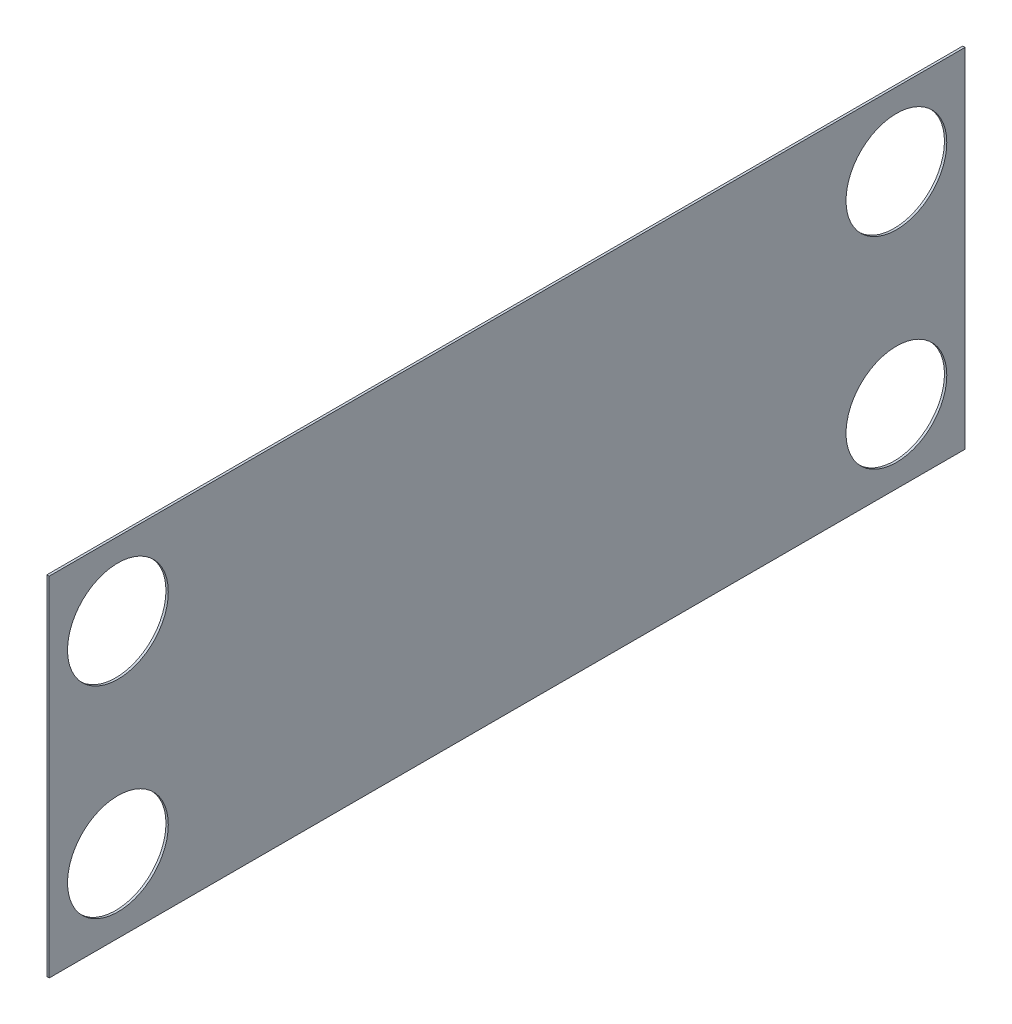
ISO-10303-21;
HEADER;
FILE_DESCRIPTION(('STEP AP214'),'2;1');
FILE_NAME('part.step','',(''),(''),'','','');
FILE_SCHEMA(('AUTOMOTIVE_DESIGN { 1 0 10303 214 1 1 1 1 }'));
ENDSEC;
DATA;
#1=APPLICATION_CONTEXT('core data for automotive mechanical design processes');
#2=APPLICATION_PROTOCOL_DEFINITION('international standard','automotive_design',2000,#1);
#3=PRODUCT_CONTEXT('',#1,'mechanical');
#4=PRODUCT('Part','Part','',(#3));
#5=PRODUCT_RELATED_PRODUCT_CATEGORY('part','',(#4));
#6=PRODUCT_DEFINITION_FORMATION('','',#4);
#7=PRODUCT_DEFINITION_CONTEXT('part definition',#1,'design');
#8=PRODUCT_DEFINITION('design','',#6,#7);
#9=PRODUCT_DEFINITION_SHAPE('','',#8);
#10=(LENGTH_UNIT() NAMED_UNIT(*) SI_UNIT(.MILLI.,.METRE.));
#11=(NAMED_UNIT(*) PLANE_ANGLE_UNIT() SI_UNIT($,.RADIAN.));
#12=(NAMED_UNIT(*) SI_UNIT($,.STERADIAN.) SOLID_ANGLE_UNIT());
#13=UNCERTAINTY_MEASURE_WITH_UNIT(LENGTH_MEASURE(1.E-05),#10,'distance_accuracy_value','');
#14=(GEOMETRIC_REPRESENTATION_CONTEXT(3) GLOBAL_UNCERTAINTY_ASSIGNED_CONTEXT((#13)) GLOBAL_UNIT_ASSIGNED_CONTEXT((#10,
#11,#12)) REPRESENTATION_CONTEXT('',''));
#15=CARTESIAN_POINT('',(0.,0.,0.));
#16=DIRECTION('',(0.,0.,1.));
#17=DIRECTION('',(1.,0.,0.));
#18=AXIS2_PLACEMENT_3D('',#15,#16,#17);
#19=CARTESIAN_POINT('',(0.254,19.,50.));
#20=DIRECTION('',(0.,0.,-1.));
#21=DIRECTION('',(-1.,0.,0.));
#22=AXIS2_PLACEMENT_3D('',#19,#20,#21);
#23=PLANE('',#22);
#24=DIRECTION('',(0.,-1.,0.));
#25=VECTOR('',#24,1.);
#26=CARTESIAN_POINT('',(0.,19.,50.));
#27=LINE('',#26,#25);
#28=CARTESIAN_POINT('',(0.,19.,50.));
#29=VERTEX_POINT('',#28);
#30=CARTESIAN_POINT('',(0.,-19.,50.));
#31=VERTEX_POINT('',#30);
#32=EDGE_CURVE('E97',#29,#31,#27,.T.);
#33=ORIENTED_EDGE('',*,*,#32,.T.);
#34=DIRECTION('',(-1.,0.,0.));
#35=VECTOR('',#34,1.);
#36=CARTESIAN_POINT('',(0.254,-19.,50.));
#37=LINE('',#36,#35);
#38=CARTESIAN_POINT('',(0.254,-19.,50.));
#39=VERTEX_POINT('',#38);
#40=EDGE_CURVE('E11',#39,#31,#37,.T.);
#41=ORIENTED_EDGE('',*,*,#40,.F.);
#42=DIRECTION('',(0.,-1.,0.));
#43=VECTOR('',#42,1.);
#44=CARTESIAN_POINT('',(0.254,19.,50.));
#45=LINE('',#44,#43);
#46=CARTESIAN_POINT('',(0.254,19.,50.));
#47=VERTEX_POINT('',#46);
#48=EDGE_CURVE('E85',#47,#39,#45,.T.);
#49=ORIENTED_EDGE('',*,*,#48,.F.);
#50=DIRECTION('',(-1.,0.,0.));
#51=VECTOR('',#50,1.);
#52=CARTESIAN_POINT('',(0.254,19.,50.));
#53=LINE('',#52,#51);
#54=EDGE_CURVE('E93',#47,#29,#53,.T.);
#55=ORIENTED_EDGE('',*,*,#54,.T.);
#56=EDGE_LOOP('',(#33,#41,#49,#55));
#57=FACE_BOUND('',#56,.T.);
#58=ADVANCED_FACE('F34',(#57),#23,.F.);
#59=CARTESIAN_POINT('',(0.254,-19.,50.));
#60=DIRECTION('',(0.,1.,0.));
#61=DIRECTION('',(0.,0.,1.));
#62=AXIS2_PLACEMENT_3D('',#59,#60,#61);
#63=PLANE('',#62);
#64=DIRECTION('',(0.,0.,-1.));
#65=VECTOR('',#64,1.);
#66=CARTESIAN_POINT('',(0.,-19.,50.));
#67=LINE('',#66,#65);
#68=CARTESIAN_POINT('',(0.,-19.,-50.));
#69=VERTEX_POINT('',#68);
#70=EDGE_CURVE('E89',#31,#69,#67,.T.);
#71=ORIENTED_EDGE('',*,*,#70,.T.);
#72=DIRECTION('',(-1.,0.,0.));
#73=VECTOR('',#72,1.);
#74=CARTESIAN_POINT('',(0.254,-19.,-50.));
#75=LINE('',#74,#73);
#76=CARTESIAN_POINT('',(0.254,-19.,-50.));
#77=VERTEX_POINT('',#76);
#78=EDGE_CURVE('E42',#77,#69,#75,.T.);
#79=ORIENTED_EDGE('',*,*,#78,.F.);
#80=DIRECTION('',(0.,0.,-1.));
#81=VECTOR('',#80,1.);
#82=CARTESIAN_POINT('',(0.254,-19.,50.));
#83=LINE('',#82,#81);
#84=EDGE_CURVE('E80',#39,#77,#83,.T.);
#85=ORIENTED_EDGE('',*,*,#84,.F.);
#86=ORIENTED_EDGE('',*,*,#40,.T.);
#87=EDGE_LOOP('',(#71,#79,#85,#86));
#88=FACE_BOUND('',#87,.T.);
#89=ADVANCED_FACE('F88',(#88),#63,.F.);
#90=CARTESIAN_POINT('',(0.254,19.,-50.));
#91=DIRECTION('',(0.,0.,1.));
#92=DIRECTION('',(1.,0.,0.));
#93=AXIS2_PLACEMENT_3D('',#90,#91,#92);
#94=PLANE('',#93);
#95=DIRECTION('',(0.,1.,0.));
#96=VECTOR('',#95,1.);
#97=CARTESIAN_POINT('',(0.,19.,-50.));
#98=LINE('',#97,#96);
#99=CARTESIAN_POINT('',(0.,19.,-50.));
#100=VERTEX_POINT('',#99);
#101=EDGE_CURVE('E67',#69,#100,#98,.T.);
#102=ORIENTED_EDGE('',*,*,#101,.T.);
#103=DIRECTION('',(-1.,0.,0.));
#104=VECTOR('',#103,1.);
#105=CARTESIAN_POINT('',(0.254,19.,-50.));
#106=LINE('',#105,#104);
#107=CARTESIAN_POINT('',(0.254,19.,-50.));
#108=VERTEX_POINT('',#107);
#109=EDGE_CURVE('E90',#108,#100,#106,.T.);
#110=ORIENTED_EDGE('',*,*,#109,.F.);
#111=DIRECTION('',(0.,1.,0.));
#112=VECTOR('',#111,1.);
#113=CARTESIAN_POINT('',(0.254,19.,-50.));
#114=LINE('',#113,#112);
#115=EDGE_CURVE('E83',#77,#108,#114,.T.);
#116=ORIENTED_EDGE('',*,*,#115,.F.);
#117=ORIENTED_EDGE('',*,*,#78,.T.);
#118=EDGE_LOOP('',(#102,#110,#116,#117));
#119=FACE_BOUND('',#118,.T.);
#120=ADVANCED_FACE('F91',(#119),#94,.F.);
#121=CARTESIAN_POINT('',(0.254,19.,50.));
#122=DIRECTION('',(0.,-1.,0.));
#123=DIRECTION('',(0.,0.,-1.));
#124=AXIS2_PLACEMENT_3D('',#121,#122,#123);
#125=PLANE('',#124);
#126=DIRECTION('',(0.,0.,1.));
#127=VECTOR('',#126,1.);
#128=CARTESIAN_POINT('',(0.,19.,50.));
#129=LINE('',#128,#127);
#130=EDGE_CURVE('E73',#100,#29,#129,.T.);
#131=ORIENTED_EDGE('',*,*,#130,.T.);
#132=ORIENTED_EDGE('',*,*,#54,.F.);
#133=DIRECTION('',(0.,0.,1.));
#134=VECTOR('',#133,1.);
#135=CARTESIAN_POINT('',(0.254,19.,50.));
#136=LINE('',#135,#134);
#137=EDGE_CURVE('E50',#108,#47,#136,.T.);
#138=ORIENTED_EDGE('',*,*,#137,.F.);
#139=ORIENTED_EDGE('',*,*,#109,.T.);
#140=EDGE_LOOP('',(#131,#132,#138,#139));
#141=FACE_BOUND('',#140,.T.);
#142=ADVANCED_FACE('F105',(#141),#125,.F.);
#143=CARTESIAN_POINT('',(0.254,0.,0.));
#144=DIRECTION('',(1.,0.,0.));
#145=DIRECTION('',(0.,0.,-1.));
#146=AXIS2_PLACEMENT_3D('',#143,#144,#145);
#147=PLANE('',#146);
#148=CARTESIAN_POINT('',(0.254000000000001,11.,42.5));
#149=DIRECTION('',(1.,0.,0.));
#150=DIRECTION('',(0.,0.,-1.));
#151=AXIS2_PLACEMENT_3D('',#148,#149,#150);
#152=CIRCLE('',#151,5.49999999999999);
#153=CARTESIAN_POINT('',(0.254000000000001,11.,37.));
#154=VERTEX_POINT('',#153);
#155=EDGE_CURVE('E131',#154,#154,#152,.T.);
#156=ORIENTED_EDGE('',*,*,#155,.F.);
#157=EDGE_LOOP('',(#156));
#158=FACE_BOUND('',#157,.T.);
#159=CARTESIAN_POINT('',(0.254000000000001,-11.,42.5));
#160=DIRECTION('',(1.,0.,0.));
#161=DIRECTION('',(0.,0.,-1.));
#162=AXIS2_PLACEMENT_3D('',#159,#160,#161);
#163=CIRCLE('',#162,5.49999999999999);
#164=CARTESIAN_POINT('',(0.254000000000001,-11.,37.));
#165=VERTEX_POINT('',#164);
#166=EDGE_CURVE('E125',#165,#165,#163,.T.);
#167=ORIENTED_EDGE('',*,*,#166,.F.);
#168=EDGE_LOOP('',(#167));
#169=FACE_BOUND('',#168,.T.);
#170=CARTESIAN_POINT('',(0.254000000000001,11.,-42.5));
#171=DIRECTION('',(1.,0.,0.));
#172=DIRECTION('',(0.,0.,-1.));
#173=AXIS2_PLACEMENT_3D('',#170,#171,#172);
#174=CIRCLE('',#173,5.49999999999999);
#175=CARTESIAN_POINT('',(0.254000000000001,11.,-48.));
#176=VERTEX_POINT('',#175);
#177=EDGE_CURVE('E119',#176,#176,#174,.T.);
#178=ORIENTED_EDGE('',*,*,#177,.F.);
#179=EDGE_LOOP('',(#178));
#180=FACE_BOUND('',#179,.T.);
#181=CARTESIAN_POINT('',(0.254000000000001,-11.,-42.5));
#182=DIRECTION('',(1.,0.,0.));
#183=DIRECTION('',(0.,0.,-1.));
#184=AXIS2_PLACEMENT_3D('',#181,#182,#183);
#185=CIRCLE('',#184,5.49999999999999);
#186=CARTESIAN_POINT('',(0.254000000000001,-11.,-48.));
#187=VERTEX_POINT('',#186);
#188=EDGE_CURVE('E113',#187,#187,#185,.T.);
#189=ORIENTED_EDGE('',*,*,#188,.F.);
#190=EDGE_LOOP('',(#189));
#191=FACE_BOUND('',#190,.T.);
#192=ORIENTED_EDGE('',*,*,#48,.T.);
#193=ORIENTED_EDGE('',*,*,#84,.T.);
#194=ORIENTED_EDGE('',*,*,#115,.T.);
#195=ORIENTED_EDGE('',*,*,#137,.T.);
#196=EDGE_LOOP('',(#192,#193,#194,#195));
#197=FACE_BOUND('',#196,.T.);
#198=ADVANCED_FACE('F81',(#158,#169,#180,#191,#197),#147,.T.);
#199=CARTESIAN_POINT('',(0.,0.,0.));
#200=DIRECTION('',(1.,0.,0.));
#201=DIRECTION('',(0.,0.,-1.));
#202=AXIS2_PLACEMENT_3D('',#199,#200,#201);
#203=PLANE('',#202);
#204=CARTESIAN_POINT('',(0.,11.,42.5));
#205=DIRECTION('',(1.,0.,0.));
#206=DIRECTION('',(0.,0.,-1.));
#207=AXIS2_PLACEMENT_3D('',#204,#205,#206);
#208=CIRCLE('',#207,5.5);
#209=CARTESIAN_POINT('',(0.,11.,37.));
#210=VERTEX_POINT('',#209);
#211=EDGE_CURVE('E128',#210,#210,#208,.T.);
#212=ORIENTED_EDGE('',*,*,#211,.T.);
#213=EDGE_LOOP('',(#212));
#214=FACE_BOUND('',#213,.T.);
#215=CARTESIAN_POINT('',(0.,-11.,42.5));
#216=DIRECTION('',(1.,0.,0.));
#217=DIRECTION('',(0.,0.,-1.));
#218=AXIS2_PLACEMENT_3D('',#215,#216,#217);
#219=CIRCLE('',#218,5.5);
#220=CARTESIAN_POINT('',(0.,-11.,37.));
#221=VERTEX_POINT('',#220);
#222=EDGE_CURVE('E122',#221,#221,#219,.T.);
#223=ORIENTED_EDGE('',*,*,#222,.T.);
#224=EDGE_LOOP('',(#223));
#225=FACE_BOUND('',#224,.T.);
#226=CARTESIAN_POINT('',(0.,11.,-42.5));
#227=DIRECTION('',(1.,0.,0.));
#228=DIRECTION('',(0.,0.,-1.));
#229=AXIS2_PLACEMENT_3D('',#226,#227,#228);
#230=CIRCLE('',#229,5.5);
#231=CARTESIAN_POINT('',(0.,11.,-48.));
#232=VERTEX_POINT('',#231);
#233=EDGE_CURVE('E116',#232,#232,#230,.T.);
#234=ORIENTED_EDGE('',*,*,#233,.T.);
#235=EDGE_LOOP('',(#234));
#236=FACE_BOUND('',#235,.T.);
#237=CARTESIAN_POINT('',(0.,-11.,-42.5));
#238=DIRECTION('',(1.,0.,0.));
#239=DIRECTION('',(0.,0.,-1.));
#240=AXIS2_PLACEMENT_3D('',#237,#238,#239);
#241=CIRCLE('',#240,5.5);
#242=CARTESIAN_POINT('',(0.,-11.,-48.));
#243=VERTEX_POINT('',#242);
#244=EDGE_CURVE('E100',#243,#243,#241,.T.);
#245=ORIENTED_EDGE('',*,*,#244,.T.);
#246=EDGE_LOOP('',(#245));
#247=FACE_BOUND('',#246,.T.);
#248=ORIENTED_EDGE('',*,*,#32,.F.);
#249=ORIENTED_EDGE('',*,*,#130,.F.);
#250=ORIENTED_EDGE('',*,*,#101,.F.);
#251=ORIENTED_EDGE('',*,*,#70,.F.);
#252=EDGE_LOOP('',(#248,#249,#250,#251));
#253=FACE_BOUND('',#252,.T.);
#254=ADVANCED_FACE('F108',(#214,#225,#236,#247,#253),#203,.F.);
#255=CARTESIAN_POINT('',(0.254,-11.,-42.5));
#256=DIRECTION('',(1.,0.,0.));
#257=DIRECTION('',(0.,0.,-1.));
#258=AXIS2_PLACEMENT_3D('',#255,#256,#257);
#259=CYLINDRICAL_SURFACE('',#258,5.49999999999999);
#260=ORIENTED_EDGE('',*,*,#244,.F.);
#261=EDGE_LOOP('',(#260));
#262=FACE_BOUND('',#261,.T.);
#263=ORIENTED_EDGE('',*,*,#188,.T.);
#264=EDGE_LOOP('',(#263));
#265=FACE_BOUND('',#264,.T.);
#266=ADVANCED_FACE('F146',(#262,#265),#259,.F.);
#267=CARTESIAN_POINT('',(0.254,11.,-42.5));
#268=DIRECTION('',(1.,0.,0.));
#269=DIRECTION('',(0.,0.,-1.));
#270=AXIS2_PLACEMENT_3D('',#267,#268,#269);
#271=CYLINDRICAL_SURFACE('',#270,5.49999999999999);
#272=ORIENTED_EDGE('',*,*,#233,.F.);
#273=EDGE_LOOP('',(#272));
#274=FACE_BOUND('',#273,.T.);
#275=ORIENTED_EDGE('',*,*,#177,.T.);
#276=EDGE_LOOP('',(#275));
#277=FACE_BOUND('',#276,.T.);
#278=ADVANCED_FACE('F148',(#274,#277),#271,.F.);
#279=CARTESIAN_POINT('',(0.254,-11.,42.5));
#280=DIRECTION('',(1.,0.,0.));
#281=DIRECTION('',(0.,0.,-1.));
#282=AXIS2_PLACEMENT_3D('',#279,#280,#281);
#283=CYLINDRICAL_SURFACE('',#282,5.49999999999999);
#284=ORIENTED_EDGE('',*,*,#222,.F.);
#285=EDGE_LOOP('',(#284));
#286=FACE_BOUND('',#285,.T.);
#287=ORIENTED_EDGE('',*,*,#166,.T.);
#288=EDGE_LOOP('',(#287));
#289=FACE_BOUND('',#288,.T.);
#290=ADVANCED_FACE('F155',(#286,#289),#283,.F.);
#291=CARTESIAN_POINT('',(0.254,11.,42.5));
#292=DIRECTION('',(1.,0.,0.));
#293=DIRECTION('',(0.,0.,-1.));
#294=AXIS2_PLACEMENT_3D('',#291,#292,#293);
#295=CYLINDRICAL_SURFACE('',#294,5.49999999999999);
#296=ORIENTED_EDGE('',*,*,#211,.F.);
#297=EDGE_LOOP('',(#296));
#298=FACE_BOUND('',#297,.T.);
#299=ORIENTED_EDGE('',*,*,#155,.T.);
#300=EDGE_LOOP('',(#299));
#301=FACE_BOUND('',#300,.T.);
#302=ADVANCED_FACE('F135',(#298,#301),#295,.F.);
#303=CLOSED_SHELL('',(#58,#89,#120,#142,#198,#254,#266,#278,#290,#302));
#304=MANIFOLD_SOLID_BREP('B2',#303);
#305=ADVANCED_BREP_SHAPE_REPRESENTATION('',(#18,#304),#14);
#306=SHAPE_DEFINITION_REPRESENTATION(#9,#305);
ENDSEC;
END-ISO-10303-21;
